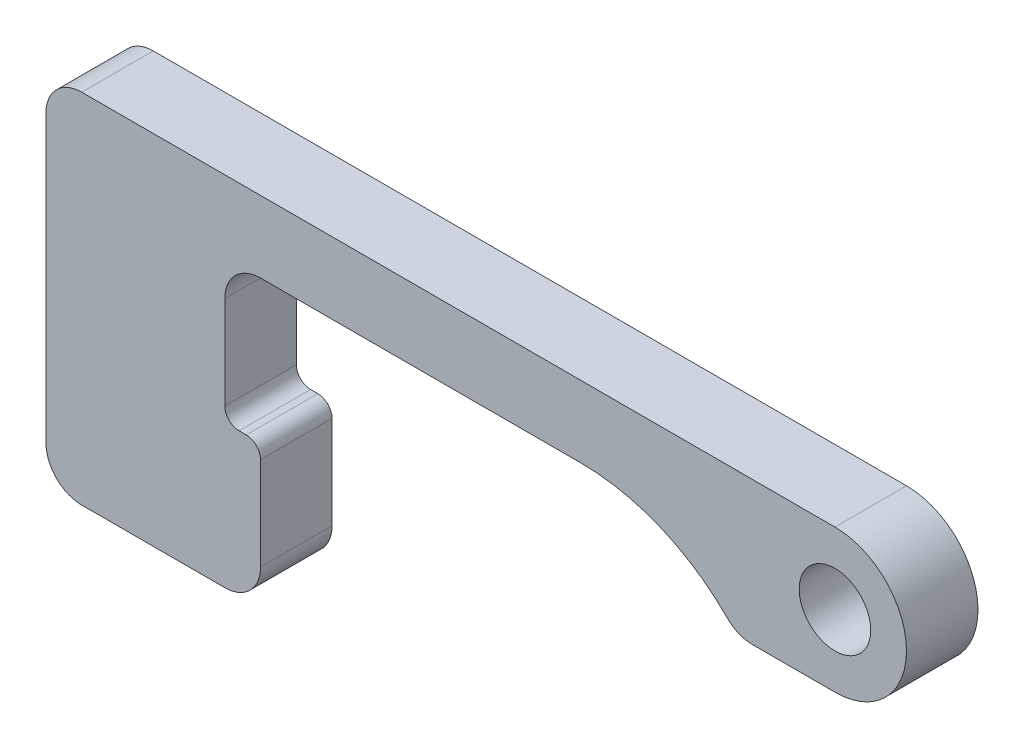
ISO-10303-21;
HEADER;
FILE_DESCRIPTION(('STEP AP214'),'2;1');
FILE_NAME('part.step','',(''),(''),'','','');
FILE_SCHEMA(('AUTOMOTIVE_DESIGN { 1 0 10303 214 1 1 1 1 }'));
ENDSEC;
DATA;
#1=APPLICATION_CONTEXT('core data for automotive mechanical design processes');
#2=APPLICATION_PROTOCOL_DEFINITION('international standard','automotive_design',2000,#1);
#3=PRODUCT_CONTEXT('',#1,'mechanical');
#4=PRODUCT('Part','Part','',(#3));
#5=PRODUCT_RELATED_PRODUCT_CATEGORY('part','',(#4));
#6=PRODUCT_DEFINITION_FORMATION('','',#4);
#7=PRODUCT_DEFINITION_CONTEXT('part definition',#1,'design');
#8=PRODUCT_DEFINITION('design','',#6,#7);
#9=PRODUCT_DEFINITION_SHAPE('','',#8);
#10=(LENGTH_UNIT() NAMED_UNIT(*) SI_UNIT(.MILLI.,.METRE.));
#11=(NAMED_UNIT(*) PLANE_ANGLE_UNIT() SI_UNIT($,.RADIAN.));
#12=(NAMED_UNIT(*) SI_UNIT($,.STERADIAN.) SOLID_ANGLE_UNIT());
#13=UNCERTAINTY_MEASURE_WITH_UNIT(LENGTH_MEASURE(1.E-05),#10,'distance_accuracy_value','');
#14=(GEOMETRIC_REPRESENTATION_CONTEXT(3) GLOBAL_UNCERTAINTY_ASSIGNED_CONTEXT((#13)) GLOBAL_UNIT_ASSIGNED_CONTEXT((#10,
#11,#12)) REPRESENTATION_CONTEXT('',''));
#15=CARTESIAN_POINT('',(0.,0.,0.));
#16=DIRECTION('',(0.,0.,1.));
#17=DIRECTION('',(1.,0.,0.));
#18=AXIS2_PLACEMENT_3D('',#15,#16,#17);
#19=CARTESIAN_POINT('',(0.,0.,10.));
#20=DIRECTION('',(0.,0.,1.));
#21=DIRECTION('',(1.,0.,0.));
#22=AXIS2_PLACEMENT_3D('',#19,#20,#21);
#23=PLANE('',#22);
#24=DIRECTION('',(0.,1.,0.));
#25=VECTOR('',#24,1.);
#26=CARTESIAN_POINT('',(-80.3169457006491,-20.,10.));
#27=LINE('',#26,#25);
#28=CARTESIAN_POINT('',(-80.3169457006491,-35.,10.));
#29=VERTEX_POINT('',#28);
#30=CARTESIAN_POINT('',(-80.3169457006491,-22.,10.));
#31=VERTEX_POINT('',#30);
#32=EDGE_CURVE('E246',#29,#31,#27,.T.);
#33=ORIENTED_EDGE('',*,*,#32,.T.);
#34=CARTESIAN_POINT('',(-82.3169457006491,-22.,10.));
#35=DIRECTION('',(0.,0.,1.));
#36=DIRECTION('',(1.,0.,0.));
#37=AXIS2_PLACEMENT_3D('',#34,#35,#36);
#38=CIRCLE('',#37,2.);
#39=CARTESIAN_POINT('',(-82.3169457006491,-20.,10.));
#40=VERTEX_POINT('',#39);
#41=EDGE_CURVE('E331',#31,#40,#38,.T.);
#42=ORIENTED_EDGE('',*,*,#41,.T.);
#43=DIRECTION('',(-1.,0.,0.));
#44=VECTOR('',#43,1.);
#45=CARTESIAN_POINT('',(-85.3169457006491,-20.,10.));
#46=LINE('',#45,#44);
#47=CARTESIAN_POINT('',(-83.3169457006491,-20.,10.));
#48=VERTEX_POINT('',#47);
#49=EDGE_CURVE('E348',#40,#48,#46,.T.);
#50=ORIENTED_EDGE('',*,*,#49,.T.);
#51=CARTESIAN_POINT('',(-83.3169457006491,-18.,10.));
#52=DIRECTION('',(0.,0.,1.));
#53=DIRECTION('',(1.,0.,0.));
#54=AXIS2_PLACEMENT_3D('',#51,#52,#53);
#55=CIRCLE('',#54,2.);
#56=CARTESIAN_POINT('',(-85.3169457006491,-18.,10.));
#57=VERTEX_POINT('',#56);
#58=EDGE_CURVE('E11',#48,#57,#55,.F.);
#59=ORIENTED_EDGE('',*,*,#58,.T.);
#60=DIRECTION('',(0.,1.,0.));
#61=VECTOR('',#60,1.);
#62=CARTESIAN_POINT('',(-85.3169457006491,0.,10.));
#63=LINE('',#62,#61);
#64=CARTESIAN_POINT('',(-85.3169457006491,-4.99999999999999,10.));
#65=VERTEX_POINT('',#64);
#66=EDGE_CURVE('E172',#57,#65,#63,.T.);
#67=ORIENTED_EDGE('',*,*,#66,.T.);
#68=CARTESIAN_POINT('',(-80.3169457006491,-4.99999999999999,10.));
#69=DIRECTION('',(0.,0.,1.));
#70=DIRECTION('',(1.,0.,0.));
#71=AXIS2_PLACEMENT_3D('',#68,#69,#70);
#72=CIRCLE('',#71,5.);
#73=CARTESIAN_POINT('',(-80.3169457006491,0.,10.));
#74=VERTEX_POINT('',#73);
#75=EDGE_CURVE('E167',#65,#74,#72,.F.);
#76=ORIENTED_EDGE('',*,*,#75,.T.);
#77=DIRECTION('',(1.,0.,0.));
#78=VECTOR('',#77,1.);
#79=CARTESIAN_POINT('',(-85.3169457006491,0.,10.));
#80=LINE('',#79,#78);
#81=CARTESIAN_POINT('',(-35.5537132832868,0.,10.));
#82=VERTEX_POINT('',#81);
#83=EDGE_CURVE('E160',#74,#82,#80,.T.);
#84=ORIENTED_EDGE('',*,*,#83,.T.);
#85=CARTESIAN_POINT('',(-35.5537132832868,-28.8705016718932,10.));
#86=DIRECTION('',(0.,0.,-1.));
#87=DIRECTION('',(1.,0.,0.));
#88=AXIS2_PLACEMENT_3D('',#85,#86,#87);
#89=CIRCLE('',#88,28.8705016718932);
#90=CARTESIAN_POINT('',(-15.0715952576336,-8.52378921090821,10.));
#91=VERTEX_POINT('',#90);
#92=EDGE_CURVE('E164',#82,#91,#89,.T.);
#93=ORIENTED_EDGE('',*,*,#92,.T.);
#94=CARTESIAN_POINT('',(-11.5243555424344,-5.,10.));
#95=DIRECTION('',(0.,0.,1.));
#96=DIRECTION('',(1.,0.,0.));
#97=AXIS2_PLACEMENT_3D('',#94,#95,#96);
#98=CIRCLE('',#97,5.);
#99=CARTESIAN_POINT('',(-11.5243555424344,-10.,10.));
#100=VERTEX_POINT('',#99);
#101=EDGE_CURVE('E286',#91,#100,#98,.T.);
#102=ORIENTED_EDGE('',*,*,#101,.T.);
#103=DIRECTION('',(1.,0.,0.));
#104=VECTOR('',#103,1.);
#105=CARTESIAN_POINT('',(0.,-10.,10.));
#106=LINE('',#105,#104);
#107=CARTESIAN_POINT('',(0.,-10.,10.));
#108=VERTEX_POINT('',#107);
#109=EDGE_CURVE('E190',#100,#108,#106,.T.);
#110=ORIENTED_EDGE('',*,*,#109,.T.);
#111=CARTESIAN_POINT('',(0.,0.,10.));
#112=DIRECTION('',(0.,0.,1.));
#113=DIRECTION('',(1.,0.,0.));
#114=AXIS2_PLACEMENT_3D('',#111,#112,#113);
#115=CIRCLE('',#114,10.);
#116=CARTESIAN_POINT('',(0.,10.,10.));
#117=VERTEX_POINT('',#116);
#118=EDGE_CURVE('E193',#108,#117,#115,.T.);
#119=ORIENTED_EDGE('',*,*,#118,.T.);
#120=DIRECTION('',(-1.,0.,0.));
#121=VECTOR('',#120,1.);
#122=CARTESIAN_POINT('',(-110.316945700649,10.,10.));
#123=LINE('',#122,#121);
#124=CARTESIAN_POINT('',(-105.316945700649,10.,10.));
#125=VERTEX_POINT('',#124);
#126=EDGE_CURVE('E199',#117,#125,#123,.T.);
#127=ORIENTED_EDGE('',*,*,#126,.T.);
#128=CARTESIAN_POINT('',(-105.316945700649,5.,10.));
#129=DIRECTION('',(0.,0.,1.));
#130=DIRECTION('',(1.,0.,0.));
#131=AXIS2_PLACEMENT_3D('',#128,#129,#130);
#132=CIRCLE('',#131,5.);
#133=CARTESIAN_POINT('',(-110.316945700649,4.99999999999999,10.));
#134=VERTEX_POINT('',#133);
#135=EDGE_CURVE('E283',#125,#134,#132,.T.);
#136=ORIENTED_EDGE('',*,*,#135,.T.);
#137=DIRECTION('',(0.,-1.,0.));
#138=VECTOR('',#137,1.);
#139=CARTESIAN_POINT('',(-110.316945700649,-40.,10.));
#140=LINE('',#139,#138);
#141=CARTESIAN_POINT('',(-110.316945700649,-35.,10.));
#142=VERTEX_POINT('',#141);
#143=EDGE_CURVE('E203',#134,#142,#140,.T.);
#144=ORIENTED_EDGE('',*,*,#143,.T.);
#145=CARTESIAN_POINT('',(-105.316945700649,-35.,10.));
#146=DIRECTION('',(0.,0.,1.));
#147=DIRECTION('',(1.,0.,0.));
#148=AXIS2_PLACEMENT_3D('',#145,#146,#147);
#149=CIRCLE('',#148,5.);
#150=CARTESIAN_POINT('',(-105.316945700649,-40.,10.));
#151=VERTEX_POINT('',#150);
#152=EDGE_CURVE('E277',#142,#151,#149,.T.);
#153=ORIENTED_EDGE('',*,*,#152,.T.);
#154=DIRECTION('',(1.,0.,0.));
#155=VECTOR('',#154,1.);
#156=CARTESIAN_POINT('',(-80.3169457006491,-40.,10.));
#157=LINE('',#156,#155);
#158=CARTESIAN_POINT('',(-85.3169457006491,-40.,10.));
#159=VERTEX_POINT('',#158);
#160=EDGE_CURVE('E207',#151,#159,#157,.T.);
#161=ORIENTED_EDGE('',*,*,#160,.T.);
#162=CARTESIAN_POINT('',(-85.3169457006491,-35.,10.));
#163=DIRECTION('',(0.,0.,1.));
#164=DIRECTION('',(1.,0.,0.));
#165=AXIS2_PLACEMENT_3D('',#162,#163,#164);
#166=CIRCLE('',#165,5.);
#167=EDGE_CURVE('E280',#159,#29,#166,.T.);
#168=ORIENTED_EDGE('',*,*,#167,.T.);
#169=EDGE_LOOP('',(#33,#42,#50,#59,#67,#76,#84,#93,#102,#110,#119,#127,#136,#144,#153,#161,#168));
#170=FACE_BOUND('',#169,.T.);
#171=CARTESIAN_POINT('',(0.,0.,10.));
#172=DIRECTION('',(0.,0.,1.));
#173=DIRECTION('',(1.,0.,0.));
#174=AXIS2_PLACEMENT_3D('',#171,#172,#173);
#175=CIRCLE('',#174,4.99999999999999);
#176=CARTESIAN_POINT('',(4.99999999999999,0.,10.));
#177=VERTEX_POINT('',#176);
#178=EDGE_CURVE('E216',#177,#177,#175,.T.);
#179=ORIENTED_EDGE('',*,*,#178,.F.);
#180=EDGE_LOOP('',(#179));
#181=FACE_BOUND('',#180,.T.);
#182=ADVANCED_FACE('F39',(#170,#181),#23,.T.);
#183=CARTESIAN_POINT('',(0.,0.,0.));
#184=DIRECTION('',(0.,0.,1.));
#185=DIRECTION('',(1.,0.,0.));
#186=AXIS2_PLACEMENT_3D('',#183,#184,#185);
#187=PLANE('',#186);
#188=DIRECTION('',(-1.,0.,0.));
#189=VECTOR('',#188,1.);
#190=CARTESIAN_POINT('',(-85.3169457006491,-20.,0.));
#191=LINE('',#190,#189);
#192=CARTESIAN_POINT('',(-82.3169457006491,-20.,0.));
#193=VERTEX_POINT('',#192);
#194=CARTESIAN_POINT('',(-83.3169457006491,-20.,0.));
#195=VERTEX_POINT('',#194);
#196=EDGE_CURVE('E215',#193,#195,#191,.T.);
#197=ORIENTED_EDGE('',*,*,#196,.F.);
#198=CARTESIAN_POINT('',(-82.3169457006491,-22.,0.));
#199=DIRECTION('',(0.,0.,1.));
#200=DIRECTION('',(1.,0.,0.));
#201=AXIS2_PLACEMENT_3D('',#198,#199,#200);
#202=CIRCLE('',#201,2.);
#203=CARTESIAN_POINT('',(-80.3169457006491,-22.,0.));
#204=VERTEX_POINT('',#203);
#205=EDGE_CURVE('E63',#193,#204,#202,.F.);
#206=ORIENTED_EDGE('',*,*,#205,.T.);
#207=DIRECTION('',(0.,1.,0.));
#208=VECTOR('',#207,1.);
#209=CARTESIAN_POINT('',(-80.3169457006491,-20.,0.));
#210=LINE('',#209,#208);
#211=CARTESIAN_POINT('',(-80.3169457006491,-35.,0.));
#212=VERTEX_POINT('',#211);
#213=EDGE_CURVE('E212',#212,#204,#210,.T.);
#214=ORIENTED_EDGE('',*,*,#213,.F.);
#215=CARTESIAN_POINT('',(-85.3169457006491,-35.,0.));
#216=DIRECTION('',(0.,0.,1.));
#217=DIRECTION('',(1.,0.,0.));
#218=AXIS2_PLACEMENT_3D('',#215,#216,#217);
#219=CIRCLE('',#218,5.);
#220=CARTESIAN_POINT('',(-85.3169457006491,-40.,0.));
#221=VERTEX_POINT('',#220);
#222=EDGE_CURVE('E266',#212,#221,#219,.F.);
#223=ORIENTED_EDGE('',*,*,#222,.T.);
#224=DIRECTION('',(1.,0.,0.));
#225=VECTOR('',#224,1.);
#226=CARTESIAN_POINT('',(-80.3169457006491,-40.,0.));
#227=LINE('',#226,#225);
#228=CARTESIAN_POINT('',(-105.316945700649,-40.,0.));
#229=VERTEX_POINT('',#228);
#230=EDGE_CURVE('E242',#229,#221,#227,.T.);
#231=ORIENTED_EDGE('',*,*,#230,.F.);
#232=CARTESIAN_POINT('',(-105.316945700649,-35.,0.));
#233=DIRECTION('',(0.,0.,1.));
#234=DIRECTION('',(1.,0.,0.));
#235=AXIS2_PLACEMENT_3D('',#232,#233,#234);
#236=CIRCLE('',#235,5.);
#237=CARTESIAN_POINT('',(-110.316945700649,-35.,0.));
#238=VERTEX_POINT('',#237);
#239=EDGE_CURVE('E263',#229,#238,#236,.F.);
#240=ORIENTED_EDGE('',*,*,#239,.T.);
#241=DIRECTION('',(0.,-1.,0.));
#242=VECTOR('',#241,1.);
#243=CARTESIAN_POINT('',(-110.316945700649,-40.,0.));
#244=LINE('',#243,#242);
#245=CARTESIAN_POINT('',(-110.316945700649,4.99999999999999,0.));
#246=VERTEX_POINT('',#245);
#247=EDGE_CURVE('E238',#246,#238,#244,.T.);
#248=ORIENTED_EDGE('',*,*,#247,.F.);
#249=CARTESIAN_POINT('',(-105.316945700649,5.,0.));
#250=DIRECTION('',(0.,0.,1.));
#251=DIRECTION('',(1.,0.,0.));
#252=AXIS2_PLACEMENT_3D('',#249,#250,#251);
#253=CIRCLE('',#252,5.);
#254=CARTESIAN_POINT('',(-105.316945700649,10.,0.));
#255=VERTEX_POINT('',#254);
#256=EDGE_CURVE('E269',#246,#255,#253,.F.);
#257=ORIENTED_EDGE('',*,*,#256,.T.);
#258=DIRECTION('',(-1.,0.,0.));
#259=VECTOR('',#258,1.);
#260=CARTESIAN_POINT('',(-110.316945700649,10.,0.));
#261=LINE('',#260,#259);
#262=CARTESIAN_POINT('',(0.,10.,0.));
#263=VERTEX_POINT('',#262);
#264=EDGE_CURVE('E234',#263,#255,#261,.T.);
#265=ORIENTED_EDGE('',*,*,#264,.F.);
#266=CARTESIAN_POINT('',(0.,0.,0.));
#267=DIRECTION('',(0.,0.,1.));
#268=DIRECTION('',(1.,0.,0.));
#269=AXIS2_PLACEMENT_3D('',#266,#267,#268);
#270=CIRCLE('',#269,10.);
#271=CARTESIAN_POINT('',(0.,-10.,0.));
#272=VERTEX_POINT('',#271);
#273=EDGE_CURVE('E231',#272,#263,#270,.T.);
#274=ORIENTED_EDGE('',*,*,#273,.F.);
#275=DIRECTION('',(1.,0.,0.));
#276=VECTOR('',#275,1.);
#277=CARTESIAN_POINT('',(0.,-10.,0.));
#278=LINE('',#277,#276);
#279=CARTESIAN_POINT('',(-11.5243555424344,-10.,0.));
#280=VERTEX_POINT('',#279);
#281=EDGE_CURVE('E228',#280,#272,#278,.T.);
#282=ORIENTED_EDGE('',*,*,#281,.F.);
#283=CARTESIAN_POINT('',(-11.5243555424344,-5.,0.));
#284=DIRECTION('',(0.,0.,1.));
#285=DIRECTION('',(1.,0.,0.));
#286=AXIS2_PLACEMENT_3D('',#283,#284,#285);
#287=CIRCLE('',#286,5.);
#288=CARTESIAN_POINT('',(-15.0715952576336,-8.52378921090821,0.));
#289=VERTEX_POINT('',#288);
#290=EDGE_CURVE('E272',#280,#289,#287,.F.);
#291=ORIENTED_EDGE('',*,*,#290,.T.);
#292=CARTESIAN_POINT('',(-35.5537132832868,-28.8705016718932,0.));
#293=DIRECTION('',(0.,0.,-1.));
#294=DIRECTION('',(1.,0.,0.));
#295=AXIS2_PLACEMENT_3D('',#292,#293,#294);
#296=CIRCLE('',#295,28.8705016718932);
#297=CARTESIAN_POINT('',(-35.5537132832868,0.,0.));
#298=VERTEX_POINT('',#297);
#299=EDGE_CURVE('E225',#298,#289,#296,.T.);
#300=ORIENTED_EDGE('',*,*,#299,.F.);
#301=DIRECTION('',(1.,0.,0.));
#302=VECTOR('',#301,1.);
#303=CARTESIAN_POINT('',(-85.3169457006491,0.,0.));
#304=LINE('',#303,#302);
#305=CARTESIAN_POINT('',(-80.3169457006491,0.,0.));
#306=VERTEX_POINT('',#305);
#307=EDGE_CURVE('E178',#306,#298,#304,.T.);
#308=ORIENTED_EDGE('',*,*,#307,.F.);
#309=CARTESIAN_POINT('',(-80.3169457006491,-4.99999999999999,0.));
#310=DIRECTION('',(0.,0.,1.));
#311=DIRECTION('',(1.,0.,0.));
#312=AXIS2_PLACEMENT_3D('',#309,#310,#311);
#313=CIRCLE('',#312,5.);
#314=CARTESIAN_POINT('',(-85.3169457006491,-4.99999999999999,0.));
#315=VERTEX_POINT('',#314);
#316=EDGE_CURVE('E310',#306,#315,#313,.T.);
#317=ORIENTED_EDGE('',*,*,#316,.T.);
#318=DIRECTION('',(0.,1.,0.));
#319=VECTOR('',#318,1.);
#320=CARTESIAN_POINT('',(-85.3169457006491,0.,0.));
#321=LINE('',#320,#319);
#322=CARTESIAN_POINT('',(-85.3169457006491,-18.,0.));
#323=VERTEX_POINT('',#322);
#324=EDGE_CURVE('E220',#323,#315,#321,.T.);
#325=ORIENTED_EDGE('',*,*,#324,.F.);
#326=CARTESIAN_POINT('',(-83.3169457006491,-18.,0.));
#327=DIRECTION('',(0.,0.,1.));
#328=DIRECTION('',(1.,0.,0.));
#329=AXIS2_PLACEMENT_3D('',#326,#327,#328);
#330=CIRCLE('',#329,2.);
#331=EDGE_CURVE('E48',#323,#195,#330,.T.);
#332=ORIENTED_EDGE('',*,*,#331,.T.);
#333=EDGE_LOOP('',(#197,#206,#214,#223,#231,#240,#248,#257,#265,#274,#282,#291,#300,#308,#317,
#325,#332));
#334=FACE_BOUND('',#333,.T.);
#335=CARTESIAN_POINT('',(0.,0.,0.));
#336=DIRECTION('',(0.,0.,1.));
#337=DIRECTION('',(1.,0.,0.));
#338=AXIS2_PLACEMENT_3D('',#335,#336,#337);
#339=CIRCLE('',#338,4.99999999999999);
#340=CARTESIAN_POINT('',(4.99999999999999,0.,0.));
#341=VERTEX_POINT('',#340);
#342=EDGE_CURVE('E358',#341,#341,#339,.T.);
#343=ORIENTED_EDGE('',*,*,#342,.T.);
#344=EDGE_LOOP('',(#343));
#345=FACE_BOUND('',#344,.T.);
#346=ADVANCED_FACE('F335',(#334,#345),#187,.F.);
#347=CARTESIAN_POINT('',(-80.3169457006491,-20.,10.));
#348=DIRECTION('',(-1.,0.,0.));
#349=DIRECTION('',(0.,0.,1.));
#350=AXIS2_PLACEMENT_3D('',#347,#348,#349);
#351=PLANE('',#350);
#352=ORIENTED_EDGE('',*,*,#213,.T.);
#353=DIRECTION('',(0.,0.,-1.));
#354=VECTOR('',#353,1.);
#355=CARTESIAN_POINT('',(-80.3169457006491,-22.,10.));
#356=LINE('',#355,#354);
#357=EDGE_CURVE('E55',#204,#31,#356,.F.);
#358=ORIENTED_EDGE('',*,*,#357,.T.);
#359=ORIENTED_EDGE('',*,*,#32,.F.);
#360=DIRECTION('',(0.,0.,-1.));
#361=VECTOR('',#360,1.);
#362=CARTESIAN_POINT('',(-80.3169457006491,-35.,10.));
#363=LINE('',#362,#361);
#364=EDGE_CURVE('E299',#29,#212,#363,.T.);
#365=ORIENTED_EDGE('',*,*,#364,.T.);
#366=EDGE_LOOP('',(#352,#358,#359,#365));
#367=FACE_BOUND('',#366,.T.);
#368=ADVANCED_FACE('F373',(#367),#351,.F.);
#369=CARTESIAN_POINT('',(-85.3169457006491,-20.,10.));
#370=DIRECTION('',(0.,-1.,0.));
#371=DIRECTION('',(0.,0.,-1.));
#372=AXIS2_PLACEMENT_3D('',#369,#370,#371);
#373=PLANE('',#372);
#374=ORIENTED_EDGE('',*,*,#196,.T.);
#375=DIRECTION('',(0.,0.,-1.));
#376=VECTOR('',#375,1.);
#377=CARTESIAN_POINT('',(-83.3169457006491,-20.,10.));
#378=LINE('',#377,#376);
#379=EDGE_CURVE('E324',#195,#48,#378,.F.);
#380=ORIENTED_EDGE('',*,*,#379,.T.);
#381=ORIENTED_EDGE('',*,*,#49,.F.);
#382=DIRECTION('',(0.,0.,-1.));
#383=VECTOR('',#382,1.);
#384=CARTESIAN_POINT('',(-82.3169457006491,-20.,10.));
#385=LINE('',#384,#383);
#386=EDGE_CURVE('E320',#40,#193,#385,.T.);
#387=ORIENTED_EDGE('',*,*,#386,.T.);
#388=EDGE_LOOP('',(#374,#380,#381,#387));
#389=FACE_BOUND('',#388,.T.);
#390=ADVANCED_FACE('F341',(#389),#373,.F.);
#391=CARTESIAN_POINT('',(-85.3169457006491,0.,10.));
#392=DIRECTION('',(-1.,0.,0.));
#393=DIRECTION('',(0.,0.,1.));
#394=AXIS2_PLACEMENT_3D('',#391,#392,#393);
#395=PLANE('',#394);
#396=ORIENTED_EDGE('',*,*,#66,.F.);
#397=DIRECTION('',(0.,0.,-1.));
#398=VECTOR('',#397,1.);
#399=CARTESIAN_POINT('',(-85.3169457006491,-18.,0.));
#400=LINE('',#399,#398);
#401=EDGE_CURVE('E316',#57,#323,#400,.T.);
#402=ORIENTED_EDGE('',*,*,#401,.T.);
#403=ORIENTED_EDGE('',*,*,#324,.T.);
#404=DIRECTION('',(0.,0.,-1.));
#405=VECTOR('',#404,1.);
#406=CARTESIAN_POINT('',(-85.3169457006491,-4.99999999999999,10.));
#407=LINE('',#406,#405);
#408=EDGE_CURVE('E255',#315,#65,#407,.F.);
#409=ORIENTED_EDGE('',*,*,#408,.T.);
#410=EDGE_LOOP('',(#396,#402,#403,#409));
#411=FACE_BOUND('',#410,.T.);
#412=ADVANCED_FACE('F350',(#411),#395,.F.);
#413=CARTESIAN_POINT('',(-85.3169457006491,0.,10.));
#414=DIRECTION('',(0.,1.,0.));
#415=DIRECTION('',(0.,0.,1.));
#416=AXIS2_PLACEMENT_3D('',#413,#414,#415);
#417=PLANE('',#416);
#418=ORIENTED_EDGE('',*,*,#83,.F.);
#419=DIRECTION('',(0.,0.,-1.));
#420=VECTOR('',#419,1.);
#421=CARTESIAN_POINT('',(-80.3169457006491,0.,0.));
#422=LINE('',#421,#420);
#423=EDGE_CURVE('E183',#74,#306,#422,.T.);
#424=ORIENTED_EDGE('',*,*,#423,.T.);
#425=ORIENTED_EDGE('',*,*,#307,.T.);
#426=DIRECTION('',(0.,0.,-1.));
#427=VECTOR('',#426,1.);
#428=CARTESIAN_POINT('',(-35.5537132832868,0.,10.));
#429=LINE('',#428,#427);
#430=EDGE_CURVE('E175',#82,#298,#429,.T.);
#431=ORIENTED_EDGE('',*,*,#430,.F.);
#432=EDGE_LOOP('',(#418,#424,#425,#431));
#433=FACE_BOUND('',#432,.T.);
#434=ADVANCED_FACE('F176',(#433),#417,.F.);
#435=CARTESIAN_POINT('',(-35.5537132832868,-28.8705016718932,10.));
#436=DIRECTION('',(0.,0.,-1.));
#437=DIRECTION('',(-1.,0.,0.));
#438=AXIS2_PLACEMENT_3D('',#435,#436,#437);
#439=CYLINDRICAL_SURFACE('',#438,28.8705016718932);
#440=ORIENTED_EDGE('',*,*,#299,.T.);
#441=DIRECTION('',(0.,0.,-1.));
#442=VECTOR('',#441,1.);
#443=CARTESIAN_POINT('',(-15.0715952576336,-8.52378921090822,10.));
#444=LINE('',#443,#442);
#445=EDGE_CURVE('E188',#289,#91,#444,.F.);
#446=ORIENTED_EDGE('',*,*,#445,.T.);
#447=ORIENTED_EDGE('',*,*,#92,.F.);
#448=ORIENTED_EDGE('',*,*,#430,.T.);
#449=EDGE_LOOP('',(#440,#446,#447,#448));
#450=FACE_BOUND('',#449,.T.);
#451=ADVANCED_FACE('F186',(#450),#439,.F.);
#452=CARTESIAN_POINT('',(0.,-10.,10.));
#453=DIRECTION('',(0.,1.,0.));
#454=DIRECTION('',(0.,0.,1.));
#455=AXIS2_PLACEMENT_3D('',#452,#453,#454);
#456=PLANE('',#455);
#457=ORIENTED_EDGE('',*,*,#109,.F.);
#458=DIRECTION('',(0.,0.,-1.));
#459=VECTOR('',#458,1.);
#460=CARTESIAN_POINT('',(-11.5243555424344,-10.,10.));
#461=LINE('',#460,#459);
#462=EDGE_CURVE('E259',#100,#280,#461,.T.);
#463=ORIENTED_EDGE('',*,*,#462,.T.);
#464=ORIENTED_EDGE('',*,*,#281,.T.);
#465=DIRECTION('',(0.,0.,-1.));
#466=VECTOR('',#465,1.);
#467=CARTESIAN_POINT('',(0.,-10.,10.));
#468=LINE('',#467,#466);
#469=EDGE_CURVE('E184',#108,#272,#468,.T.);
#470=ORIENTED_EDGE('',*,*,#469,.F.);
#471=EDGE_LOOP('',(#457,#463,#464,#470));
#472=FACE_BOUND('',#471,.T.);
#473=ADVANCED_FACE('F392',(#472),#456,.F.);
#474=CARTESIAN_POINT('',(0.,0.,10.));
#475=DIRECTION('',(0.,0.,-1.));
#476=DIRECTION('',(-1.,0.,0.));
#477=AXIS2_PLACEMENT_3D('',#474,#475,#476);
#478=CYLINDRICAL_SURFACE('',#477,10.);
#479=ORIENTED_EDGE('',*,*,#273,.T.);
#480=DIRECTION('',(0.,0.,-1.));
#481=VECTOR('',#480,1.);
#482=CARTESIAN_POINT('',(0.,10.,10.));
#483=LINE('',#482,#481);
#484=EDGE_CURVE('E211',#117,#263,#483,.T.);
#485=ORIENTED_EDGE('',*,*,#484,.F.);
#486=ORIENTED_EDGE('',*,*,#118,.F.);
#487=ORIENTED_EDGE('',*,*,#469,.T.);
#488=EDGE_LOOP('',(#479,#485,#486,#487));
#489=FACE_BOUND('',#488,.T.);
#490=ADVANCED_FACE('F388',(#489),#478,.T.);
#491=CARTESIAN_POINT('',(-110.316945700649,10.,10.));
#492=DIRECTION('',(0.,-1.,0.));
#493=DIRECTION('',(0.,0.,-1.));
#494=AXIS2_PLACEMENT_3D('',#491,#492,#493);
#495=PLANE('',#494);
#496=ORIENTED_EDGE('',*,*,#264,.T.);
#497=DIRECTION('',(0.,0.,-1.));
#498=VECTOR('',#497,1.);
#499=CARTESIAN_POINT('',(-105.316945700649,10.,10.));
#500=LINE('',#499,#498);
#501=EDGE_CURVE('E296',#255,#125,#500,.F.);
#502=ORIENTED_EDGE('',*,*,#501,.T.);
#503=ORIENTED_EDGE('',*,*,#126,.F.);
#504=ORIENTED_EDGE('',*,*,#484,.T.);
#505=EDGE_LOOP('',(#496,#502,#503,#504));
#506=FACE_BOUND('',#505,.T.);
#507=ADVANCED_FACE('F384',(#506),#495,.F.);
#508=CARTESIAN_POINT('',(-110.316945700649,-40.,10.));
#509=DIRECTION('',(1.,0.,0.));
#510=DIRECTION('',(0.,0.,-1.));
#511=AXIS2_PLACEMENT_3D('',#508,#509,#510);
#512=PLANE('',#511);
#513=ORIENTED_EDGE('',*,*,#143,.F.);
#514=DIRECTION('',(0.,0.,-1.));
#515=VECTOR('',#514,1.);
#516=CARTESIAN_POINT('',(-110.316945700649,5.,10.));
#517=LINE('',#516,#515);
#518=EDGE_CURVE('E292',#134,#246,#517,.T.);
#519=ORIENTED_EDGE('',*,*,#518,.T.);
#520=ORIENTED_EDGE('',*,*,#247,.T.);
#521=DIRECTION('',(0.,0.,-1.));
#522=VECTOR('',#521,1.);
#523=CARTESIAN_POINT('',(-110.316945700649,-35.,10.));
#524=LINE('',#523,#522);
#525=EDGE_CURVE('E289',#238,#142,#524,.F.);
#526=ORIENTED_EDGE('',*,*,#525,.T.);
#527=EDGE_LOOP('',(#513,#519,#520,#526));
#528=FACE_BOUND('',#527,.T.);
#529=ADVANCED_FACE('F380',(#528),#512,.F.);
#530=CARTESIAN_POINT('',(-80.3169457006491,-40.,10.));
#531=DIRECTION('',(0.,1.,0.));
#532=DIRECTION('',(0.,0.,1.));
#533=AXIS2_PLACEMENT_3D('',#530,#531,#532);
#534=PLANE('',#533);
#535=ORIENTED_EDGE('',*,*,#230,.T.);
#536=DIRECTION('',(0.,0.,-1.));
#537=VECTOR('',#536,1.);
#538=CARTESIAN_POINT('',(-85.3169457006491,-40.,10.));
#539=LINE('',#538,#537);
#540=EDGE_CURVE('E307',#221,#159,#539,.F.);
#541=ORIENTED_EDGE('',*,*,#540,.T.);
#542=ORIENTED_EDGE('',*,*,#160,.F.);
#543=DIRECTION('',(0.,0.,-1.));
#544=VECTOR('',#543,1.);
#545=CARTESIAN_POINT('',(-105.316945700649,-40.,10.));
#546=LINE('',#545,#544);
#547=EDGE_CURVE('E303',#151,#229,#546,.T.);
#548=ORIENTED_EDGE('',*,*,#547,.T.);
#549=EDGE_LOOP('',(#535,#541,#542,#548));
#550=FACE_BOUND('',#549,.T.);
#551=ADVANCED_FACE('F377',(#550),#534,.F.);
#552=CARTESIAN_POINT('',(0.,0.,10.));
#553=DIRECTION('',(0.,0.,-1.));
#554=DIRECTION('',(-1.,0.,0.));
#555=AXIS2_PLACEMENT_3D('',#552,#553,#554);
#556=CYLINDRICAL_SURFACE('',#555,4.99999999999999);
#557=ORIENTED_EDGE('',*,*,#178,.T.);
#558=EDGE_LOOP('',(#557));
#559=FACE_BOUND('',#558,.T.);
#560=ORIENTED_EDGE('',*,*,#342,.F.);
#561=EDGE_LOOP('',(#560));
#562=FACE_BOUND('',#561,.T.);
#563=ADVANCED_FACE('F366',(#559,#562),#556,.F.);
#564=CARTESIAN_POINT('',(-80.3169457006491,-4.99999999999999,10.));
#565=DIRECTION('',(0.,0.,1.));
#566=DIRECTION('',(1.,0.,0.));
#567=AXIS2_PLACEMENT_3D('',#564,#565,#566);
#568=CYLINDRICAL_SURFACE('',#567,5.);
#569=ORIENTED_EDGE('',*,*,#75,.F.);
#570=ORIENTED_EDGE('',*,*,#408,.F.);
#571=ORIENTED_EDGE('',*,*,#316,.F.);
#572=ORIENTED_EDGE('',*,*,#423,.F.);
#573=EDGE_LOOP('',(#569,#570,#571,#572));
#574=FACE_BOUND('',#573,.T.);
#575=ADVANCED_FACE('F407',(#574),#568,.F.);
#576=CARTESIAN_POINT('',(-11.5243555424344,-5.,10.));
#577=DIRECTION('',(0.,0.,-1.));
#578=DIRECTION('',(-1.,0.,0.));
#579=AXIS2_PLACEMENT_3D('',#576,#577,#578);
#580=CYLINDRICAL_SURFACE('',#579,5.);
#581=ORIENTED_EDGE('',*,*,#101,.F.);
#582=ORIENTED_EDGE('',*,*,#445,.F.);
#583=ORIENTED_EDGE('',*,*,#290,.F.);
#584=ORIENTED_EDGE('',*,*,#462,.F.);
#585=EDGE_LOOP('',(#581,#582,#583,#584));
#586=FACE_BOUND('',#585,.T.);
#587=ADVANCED_FACE('F410',(#586),#580,.T.);
#588=CARTESIAN_POINT('',(-105.316945700649,5.,10.));
#589=DIRECTION('',(0.,0.,-1.));
#590=DIRECTION('',(-1.,0.,0.));
#591=AXIS2_PLACEMENT_3D('',#588,#589,#590);
#592=CYLINDRICAL_SURFACE('',#591,5.);
#593=ORIENTED_EDGE('',*,*,#135,.F.);
#594=ORIENTED_EDGE('',*,*,#501,.F.);
#595=ORIENTED_EDGE('',*,*,#256,.F.);
#596=ORIENTED_EDGE('',*,*,#518,.F.);
#597=EDGE_LOOP('',(#593,#594,#595,#596));
#598=FACE_BOUND('',#597,.T.);
#599=ADVANCED_FACE('F414',(#598),#592,.T.);
#600=CARTESIAN_POINT('',(-85.3169457006491,-35.,10.));
#601=DIRECTION('',(0.,0.,-1.));
#602=DIRECTION('',(-1.,0.,0.));
#603=AXIS2_PLACEMENT_3D('',#600,#601,#602);
#604=CYLINDRICAL_SURFACE('',#603,5.);
#605=ORIENTED_EDGE('',*,*,#167,.F.);
#606=ORIENTED_EDGE('',*,*,#540,.F.);
#607=ORIENTED_EDGE('',*,*,#222,.F.);
#608=ORIENTED_EDGE('',*,*,#364,.F.);
#609=EDGE_LOOP('',(#605,#606,#607,#608));
#610=FACE_BOUND('',#609,.T.);
#611=ADVANCED_FACE('F418',(#610),#604,.T.);
#612=CARTESIAN_POINT('',(-105.316945700649,-35.,10.));
#613=DIRECTION('',(0.,0.,-1.));
#614=DIRECTION('',(-1.,0.,0.));
#615=AXIS2_PLACEMENT_3D('',#612,#613,#614);
#616=CYLINDRICAL_SURFACE('',#615,5.);
#617=ORIENTED_EDGE('',*,*,#152,.F.);
#618=ORIENTED_EDGE('',*,*,#525,.F.);
#619=ORIENTED_EDGE('',*,*,#239,.F.);
#620=ORIENTED_EDGE('',*,*,#547,.F.);
#621=EDGE_LOOP('',(#617,#618,#619,#620));
#622=FACE_BOUND('',#621,.T.);
#623=ADVANCED_FACE('F422',(#622),#616,.T.);
#624=CARTESIAN_POINT('',(-83.3169457006491,-18.,10.));
#625=DIRECTION('',(0.,0.,1.));
#626=DIRECTION('',(1.,0.,0.));
#627=AXIS2_PLACEMENT_3D('',#624,#625,#626);
#628=CYLINDRICAL_SURFACE('',#627,2.);
#629=ORIENTED_EDGE('',*,*,#58,.F.);
#630=ORIENTED_EDGE('',*,*,#379,.F.);
#631=ORIENTED_EDGE('',*,*,#331,.F.);
#632=ORIENTED_EDGE('',*,*,#401,.F.);
#633=EDGE_LOOP('',(#629,#630,#631,#632));
#634=FACE_BOUND('',#633,.T.);
#635=ADVANCED_FACE('F346',(#634),#628,.F.);
#636=CARTESIAN_POINT('',(-82.3169457006491,-22.,10.));
#637=DIRECTION('',(0.,0.,-1.));
#638=DIRECTION('',(-1.,0.,0.));
#639=AXIS2_PLACEMENT_3D('',#636,#637,#638);
#640=CYLINDRICAL_SURFACE('',#639,2.);
#641=ORIENTED_EDGE('',*,*,#41,.F.);
#642=ORIENTED_EDGE('',*,*,#357,.F.);
#643=ORIENTED_EDGE('',*,*,#205,.F.);
#644=ORIENTED_EDGE('',*,*,#386,.F.);
#645=EDGE_LOOP('',(#641,#642,#643,#644));
#646=FACE_BOUND('',#645,.T.);
#647=ADVANCED_FACE('F41',(#646),#640,.T.);
#648=CLOSED_SHELL('',(#182,#346,#368,#390,#412,#434,#451,#473,#490,#507,#529,#551,#563,#575,
#587,#599,#611,#623,#635,#647));
#649=MANIFOLD_SOLID_BREP('B2',#648);
#650=ADVANCED_BREP_SHAPE_REPRESENTATION('',(#18,#649),#14);
#651=SHAPE_DEFINITION_REPRESENTATION(#9,#650);
ENDSEC;
END-ISO-10303-21;
